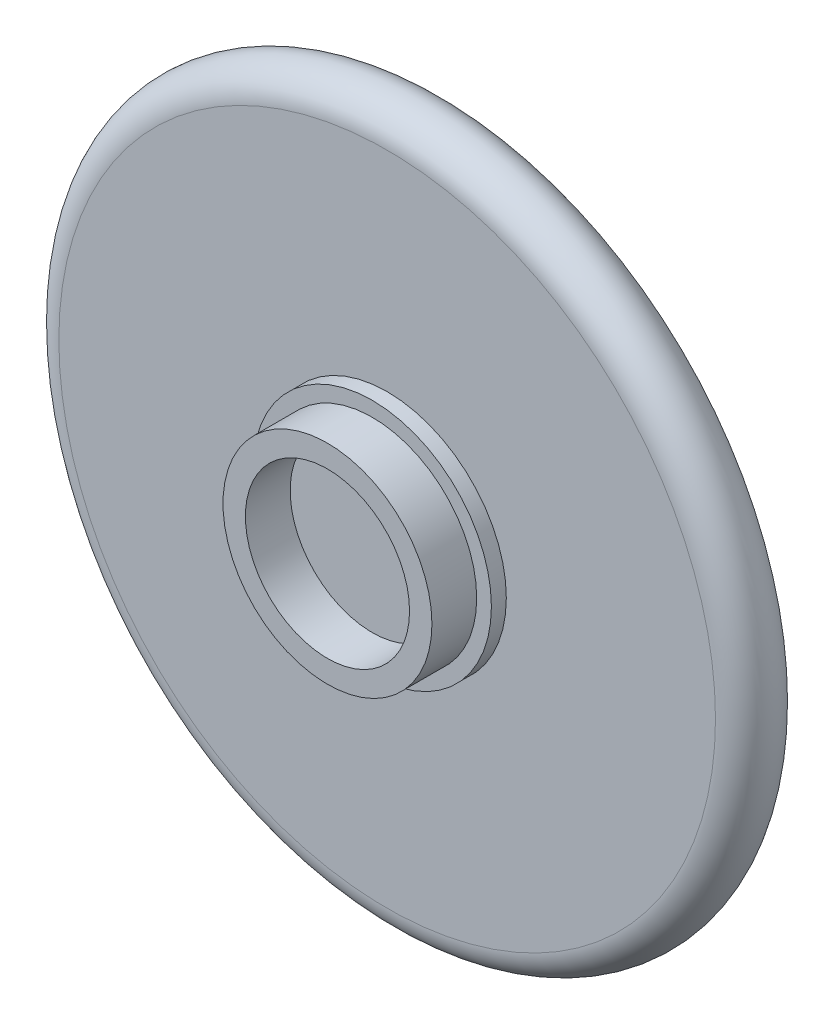
ISO-10303-21;
HEADER;
FILE_DESCRIPTION(('STEP AP214'),'2;1');
FILE_NAME('part.step','',(''),(''),'','','');
FILE_SCHEMA(('AUTOMOTIVE_DESIGN { 1 0 10303 214 1 1 1 1 }'));
ENDSEC;
DATA;
#1=APPLICATION_CONTEXT('core data for automotive mechanical design processes');
#2=APPLICATION_PROTOCOL_DEFINITION('international standard','automotive_design',2000,#1);
#3=PRODUCT_CONTEXT('',#1,'mechanical');
#4=PRODUCT('Part','Part','',(#3));
#5=PRODUCT_RELATED_PRODUCT_CATEGORY('part','',(#4));
#6=PRODUCT_DEFINITION_FORMATION('','',#4);
#7=PRODUCT_DEFINITION_CONTEXT('part definition',#1,'design');
#8=PRODUCT_DEFINITION('design','',#6,#7);
#9=PRODUCT_DEFINITION_SHAPE('','',#8);
#10=(LENGTH_UNIT() NAMED_UNIT(*) SI_UNIT(.MILLI.,.METRE.));
#11=(NAMED_UNIT(*) PLANE_ANGLE_UNIT() SI_UNIT($,.RADIAN.));
#12=(NAMED_UNIT(*) SI_UNIT($,.STERADIAN.) SOLID_ANGLE_UNIT());
#13=UNCERTAINTY_MEASURE_WITH_UNIT(LENGTH_MEASURE(1.E-05),#10,'distance_accuracy_value','');
#14=(GEOMETRIC_REPRESENTATION_CONTEXT(3) GLOBAL_UNCERTAINTY_ASSIGNED_CONTEXT((#13)) GLOBAL_UNIT_ASSIGNED_CONTEXT((#10,
#11,#12)) REPRESENTATION_CONTEXT('',''));
#15=CARTESIAN_POINT('',(0.,0.,0.));
#16=DIRECTION('',(0.,0.,1.));
#17=DIRECTION('',(1.,0.,0.));
#18=AXIS2_PLACEMENT_3D('',#15,#16,#17);
#19=CARTESIAN_POINT('',(0.,0.,0.));
#20=DIRECTION('',(0.,0.,1.));
#21=DIRECTION('',(1.,0.,0.));
#22=AXIS2_PLACEMENT_3D('',#19,#20,#21);
#23=PLANE('',#22);
#24=CARTESIAN_POINT('',(0.,0.,0.));
#25=DIRECTION('',(0.,0.,1.));
#26=DIRECTION('',(1.,0.,0.));
#27=AXIS2_PLACEMENT_3D('',#24,#25,#26);
#28=CIRCLE('',#27,11.);
#29=CARTESIAN_POINT('',(11.,0.,0.));
#30=VERTEX_POINT('',#29);
#31=EDGE_CURVE('E356',#30,#30,#28,.F.);
#32=ORIENTED_EDGE('',*,*,#31,.T.);
#33=EDGE_LOOP('',(#32));
#34=FACE_BOUND('',#33,.T.);
#35=CARTESIAN_POINT('',(0.,5.,0.));
#36=DIRECTION('',(0.,0.,-1.));
#37=DIRECTION('',(-1.,0.,0.));
#38=AXIS2_PLACEMENT_3D('',#35,#36,#37);
#39=CIRCLE('',#38,1.5);
#40=CARTESIAN_POINT('',(0.554469126158169,6.39375894190402,0.));
#41=VERTEX_POINT('',#40);
#42=CARTESIAN_POINT('',(1.49486588027154,4.876,0.));
#43=VERTEX_POINT('',#42);
#44=EDGE_CURVE('E132',#41,#43,#39,.T.);
#45=ORIENTED_EDGE('',*,*,#44,.F.);
#46=CARTESIAN_POINT('',(0.554469126158169,6.39375894190402,0.));
#47=CARTESIAN_POINT('',(1.4375906622717,6.09502868969577,0.));
#48=CARTESIAN_POINT('',(-0.00260021349907383,8.07984889549108,0.));
#49=CARTESIAN_POINT('',(0.00185258226996743,7.1934889015822,0.));
#50=CARTESIAN_POINT('',(0.442267062386248,6.86819716255026,0.));
#51=CARTESIAN_POINT('',(-0.135327531330151,6.49388301391511,0.));
#52=B_SPLINE_CURVE_WITH_KNOTS('',3,(#46,#47,#48,#49,#50,#51),.UNSPECIFIED.,.F.,.F.,(4,1,1,4),
(0.,0.556265111116708,0.561970102831868,1.),.UNSPECIFIED.);
#53=CARTESIAN_POINT('',(-0.135327531330151,6.49388301391511,0.));
#54=VERTEX_POINT('',#53);
#55=EDGE_CURVE('E449',#41,#54,#52,.T.);
#56=ORIENTED_EDGE('',*,*,#55,.T.);
#57=CARTESIAN_POINT('',(-1.49486588027154,4.876,0.));
#58=VERTEX_POINT('',#57);
#59=EDGE_CURVE('E256',#58,#54,#39,.T.);
#60=ORIENTED_EDGE('',*,*,#59,.F.);
#61=CARTESIAN_POINT('',(0.,0.,0.));
#62=DIRECTION('',(0.,0.,-1.));
#63=DIRECTION('',(-1.,0.,0.));
#64=AXIS2_PLACEMENT_3D('',#61,#62,#63);
#65=CIRCLE('',#64,5.1);
#66=CARTESIAN_POINT('',(-5.07443457698444,-0.510013454631162,0.));
#67=VERTEX_POINT('',#66);
#68=EDGE_CURVE('E417',#67,#58,#65,.T.);
#69=ORIENTED_EDGE('',*,*,#68,.F.);
#70=CARTESIAN_POINT('',(-4.60314768120767,-1.95218631923094,0.));
#71=DIRECTION('',(0.,0.,-1.));
#72=DIRECTION('',(-1.,0.,0.));
#73=AXIS2_PLACEMENT_3D('',#70,#71,#72);
#74=CIRCLE('',#73,1.5172257279386);
#75=CARTESIAN_POINT('',(-6.0903801919532,-2.25237520726706,0.));
#76=VERTEX_POINT('',#75);
#77=EDGE_CURVE('E420',#67,#76,#74,.F.);
#78=ORIENTED_EDGE('',*,*,#77,.T.);
#79=CARTESIAN_POINT('',(-6.0903801919532,-2.25237520726706,0.));
#80=CARTESIAN_POINT('',(-6.68498061089297,-1.62456301954497,0.));
#81=CARTESIAN_POINT('',(-7.28964946329909,-4.58455155737586,0.));
#82=CARTESIAN_POINT('',(-6.07150766181626,-2.36060060418071,0.));
#83=CARTESIAN_POINT('',(-5.7842065848789,-2.90459052731579,0.));
#84=B_SPLINE_CURVE_WITH_KNOTS('',3,(#79,#80,#81,#82,#83),.UNSPECIFIED.,.F.,.F.,(4,1,4),(0.,
0.568767055521497,1.),.UNSPECIFIED.);
#85=CARTESIAN_POINT('',(-5.7842065848789,-2.90459052731579,0.));
#86=VERTEX_POINT('',#85);
#87=EDGE_CURVE('E421',#76,#86,#84,.T.);
#88=ORIENTED_EDGE('',*,*,#87,.T.);
#89=CARTESIAN_POINT('',(-3.89397491719962,-3.29347223219208,0.));
#90=VERTEX_POINT('',#89);
#91=EDGE_CURVE('E425',#86,#90,#74,.F.);
#92=ORIENTED_EDGE('',*,*,#91,.T.);
#93=CARTESIAN_POINT('',(0.,0.,0.));
#94=DIRECTION('',(0.,0.,-1.));
#95=DIRECTION('',(-1.,0.,0.));
#96=AXIS2_PLACEMENT_3D('',#93,#94,#95);
#97=CIRCLE('',#96,5.1);
#98=CARTESIAN_POINT('',(3.87347032855387,-3.31756350561867,0.));
#99=VERTEX_POINT('',#98);
#100=EDGE_CURVE('E430',#99,#90,#97,.T.);
#101=ORIENTED_EDGE('',*,*,#100,.F.);
#102=CARTESIAN_POINT('',(4.58407416613072,-1.99656305670843,0.));
#103=DIRECTION('',(0.,0.,-1.));
#104=DIRECTION('',(-1.,0.,0.));
#105=AXIS2_PLACEMENT_3D('',#102,#103,#104);
#106=CIRCLE('',#105,1.5);
#107=CARTESIAN_POINT('',(5.64473433791055,-3.05722322848825,0.));
#108=VERTEX_POINT('',#107);
#109=EDGE_CURVE('E433',#108,#99,#106,.T.);
#110=ORIENTED_EDGE('',*,*,#109,.F.);
#111=CARTESIAN_POINT('',(6.0620999249139,-2.25237520726706,0.));
#112=CARTESIAN_POINT('',(6.02651758885741,-2.75104707180427,0.));
#113=CARTESIAN_POINT('',(8.75990787059198,-2.68786349761413,0.));
#114=CARTESIAN_POINT('',(5.68159124493782,-3.68700255107593,0.));
#115=CARTESIAN_POINT('',(5.64473433791055,-3.05722322848825,0.));
#116=B_SPLINE_CURVE_WITH_KNOTS('',3,(#111,#112,#113,#114,#115),.UNSPECIFIED.,.F.,.F.,(4,1,4),
(0.,0.444279510115038,1.),.UNSPECIFIED.);
#117=CARTESIAN_POINT('',(6.0620999249139,-2.25237520726706,0.));
#118=VERTEX_POINT('',#117);
#119=EDGE_CURVE('E434',#118,#108,#116,.T.);
#120=ORIENTED_EDGE('',*,*,#119,.F.);
#121=CARTESIAN_POINT('',(5.0673079250675,-0.576533080185456,0.));
#122=VERTEX_POINT('',#121);
#123=EDGE_CURVE('E439',#122,#118,#106,.T.);
#124=ORIENTED_EDGE('',*,*,#123,.F.);
#125=CARTESIAN_POINT('',(0.,0.,0.));
#126=DIRECTION('',(0.,0.,-1.));
#127=DIRECTION('',(-1.,0.,0.));
#128=AXIS2_PLACEMENT_3D('',#125,#126,#127);
#129=CIRCLE('',#128,5.1);
#130=EDGE_CURVE('E445',#43,#122,#129,.T.);
#131=ORIENTED_EDGE('',*,*,#130,.F.);
#132=EDGE_LOOP('',(#45,#56,#60,#69,#78,#88,#92,#101,#110,#120,#124,#131));
#133=FACE_BOUND('',#132,.T.);
#134=ADVANCED_FACE('F108',(#34,#133),#23,.F.);
#135=CARTESIAN_POINT('',(0.,0.,1.));
#136=DIRECTION('',(0.,0.,1.));
#137=DIRECTION('',(1.,0.,0.));
#138=AXIS2_PLACEMENT_3D('',#135,#136,#137);
#139=TOROIDAL_SURFACE('',#138,11.,1.);
#140=CARTESIAN_POINT('',(0.,0.,2.));
#141=DIRECTION('',(0.,0.,1.));
#142=DIRECTION('',(1.,0.,0.));
#143=AXIS2_PLACEMENT_3D('',#140,#141,#142);
#144=CIRCLE('',#143,11.);
#145=CARTESIAN_POINT('',(11.,0.,2.));
#146=VERTEX_POINT('',#145);
#147=EDGE_CURVE('E358',#146,#146,#144,.T.);
#148=ORIENTED_EDGE('',*,*,#147,.F.);
#149=EDGE_LOOP('',(#148));
#150=FACE_BOUND('',#149,.T.);
#151=ORIENTED_EDGE('',*,*,#31,.F.);
#152=EDGE_LOOP('',(#151));
#153=FACE_BOUND('',#152,.T.);
#154=ADVANCED_FACE('F111',(#150,#153),#139,.T.);
#155=CARTESIAN_POINT('',(0.,0.,2.));
#156=DIRECTION('',(0.,0.,1.));
#157=DIRECTION('',(1.,0.,0.));
#158=AXIS2_PLACEMENT_3D('',#155,#156,#157);
#159=PLANE('',#158);
#160=CARTESIAN_POINT('',(0.,0.,2.));
#161=DIRECTION('',(0.,0.,1.));
#162=DIRECTION('',(1.,0.,0.));
#163=AXIS2_PLACEMENT_3D('',#160,#161,#162);
#164=CIRCLE('',#163,3.99221085808089);
#165=CARTESIAN_POINT('',(3.99221085808089,0.,2.));
#166=VERTEX_POINT('',#165);
#167=EDGE_CURVE('E879',#166,#166,#164,.T.);
#168=ORIENTED_EDGE('',*,*,#167,.F.);
#169=EDGE_LOOP('',(#168));
#170=FACE_BOUND('',#169,.T.);
#171=ORIENTED_EDGE('',*,*,#147,.T.);
#172=EDGE_LOOP('',(#171));
#173=FACE_BOUND('',#172,.T.);
#174=ADVANCED_FACE('F288',(#170,#173),#159,.T.);
#175=CARTESIAN_POINT('',(0.554469126158169,6.39375894190402,-1.));
#176=CARTESIAN_POINT('',(1.4375906622717,6.09502868969577,-1.));
#177=CARTESIAN_POINT('',(-0.00260021349907383,8.07984889549108,-1.));
#178=CARTESIAN_POINT('',(0.00185258226996743,7.1934889015822,-1.));
#179=CARTESIAN_POINT('',(0.442267062386248,6.86819716255026,-1.));
#180=CARTESIAN_POINT('',(-0.135327531330151,6.49388301391511,-1.));
#181=B_SPLINE_CURVE_WITH_KNOTS('',3,(#175,#176,#177,#178,#179,#180),.UNSPECIFIED.,.F.,.F.,(4,1,
1,4),(0.,0.556265111116708,0.561970102831868,1.),.UNSPECIFIED.);
#182=DIRECTION('',(0.,0.,1.));
#183=VECTOR('',#182,1.);
#184=SURFACE_OF_LINEAR_EXTRUSION('',#181,#183);
#185=ORIENTED_EDGE('',*,*,#55,.F.);
#186=DIRECTION('',(0.,0.,1.));
#187=VECTOR('',#186,1.);
#188=CARTESIAN_POINT('',(0.554469126158169,6.39375894190402,-1.));
#189=LINE('',#188,#187);
#190=CARTESIAN_POINT('',(0.554469126158169,6.39375894190402,-1.));
#191=VERTEX_POINT('',#190);
#192=EDGE_CURVE('E372',#191,#41,#189,.T.);
#193=ORIENTED_EDGE('',*,*,#192,.F.);
#194=CARTESIAN_POINT('',(-0.135327531330151,6.49388301391511,-1.));
#195=VERTEX_POINT('',#194);
#196=EDGE_CURVE('E271',#191,#195,#181,.T.);
#197=ORIENTED_EDGE('',*,*,#196,.T.);
#198=DIRECTION('',(0.,0.,1.));
#199=VECTOR('',#198,1.);
#200=CARTESIAN_POINT('',(-0.135327531330151,6.49388301391511,-1.));
#201=LINE('',#200,#199);
#202=EDGE_CURVE('E246',#195,#54,#201,.T.);
#203=ORIENTED_EDGE('',*,*,#202,.T.);
#204=EDGE_LOOP('',(#185,#193,#197,#203));
#205=FACE_BOUND('',#204,.T.);
#206=ADVANCED_FACE('F283',(#205),#184,.T.);
#207=CARTESIAN_POINT('',(0.,5.,-1.));
#208=DIRECTION('',(0.,0.,1.));
#209=DIRECTION('',(1.,0.,0.));
#210=AXIS2_PLACEMENT_3D('',#207,#208,#209);
#211=CYLINDRICAL_SURFACE('',#210,1.5);
#212=ORIENTED_EDGE('',*,*,#44,.T.);
#213=DIRECTION('',(0.,0.,1.));
#214=VECTOR('',#213,1.);
#215=CARTESIAN_POINT('',(1.49486588027154,4.876,-1.));
#216=LINE('',#215,#214);
#217=CARTESIAN_POINT('',(1.49486588027154,4.876,-1.));
#218=VERTEX_POINT('',#217);
#219=EDGE_CURVE('E385',#218,#43,#216,.T.);
#220=ORIENTED_EDGE('',*,*,#219,.F.);
#221=CARTESIAN_POINT('',(0.,5.,-1.));
#222=DIRECTION('',(0.,0.,-1.));
#223=DIRECTION('',(-1.,0.,0.));
#224=AXIS2_PLACEMENT_3D('',#221,#222,#223);
#225=CIRCLE('',#224,1.5);
#226=EDGE_CURVE('E277',#191,#218,#225,.T.);
#227=ORIENTED_EDGE('',*,*,#226,.F.);
#228=ORIENTED_EDGE('',*,*,#192,.T.);
#229=EDGE_LOOP('',(#212,#220,#227,#228));
#230=FACE_BOUND('',#229,.T.);
#231=ADVANCED_FACE('F287',(#230),#211,.T.);
#232=CARTESIAN_POINT('',(0.,0.,-1.));
#233=DIRECTION('',(0.,0.,1.));
#234=DIRECTION('',(1.,0.,0.));
#235=AXIS2_PLACEMENT_3D('',#232,#233,#234);
#236=CYLINDRICAL_SURFACE('',#235,5.1);
#237=ORIENTED_EDGE('',*,*,#130,.T.);
#238=DIRECTION('',(0.,0.,1.));
#239=VECTOR('',#238,1.);
#240=CARTESIAN_POINT('',(5.0673079250675,-0.576533080185456,-1.));
#241=LINE('',#240,#239);
#242=CARTESIAN_POINT('',(5.0673079250675,-0.576533080185456,-1.));
#243=VERTEX_POINT('',#242);
#244=EDGE_CURVE('E388',#243,#122,#241,.T.);
#245=ORIENTED_EDGE('',*,*,#244,.F.);
#246=CARTESIAN_POINT('',(0.,0.,-1.));
#247=DIRECTION('',(0.,0.,-1.));
#248=DIRECTION('',(-1.,0.,0.));
#249=AXIS2_PLACEMENT_3D('',#246,#247,#248);
#250=CIRCLE('',#249,5.1);
#251=EDGE_CURVE('E524',#218,#243,#250,.T.);
#252=ORIENTED_EDGE('',*,*,#251,.F.);
#253=ORIENTED_EDGE('',*,*,#219,.T.);
#254=EDGE_LOOP('',(#237,#245,#252,#253));
#255=FACE_BOUND('',#254,.T.);
#256=ADVANCED_FACE('F290',(#255),#236,.T.);
#257=CARTESIAN_POINT('',(4.58407416613072,-1.99656305670843,-1.));
#258=DIRECTION('',(0.,0.,1.));
#259=DIRECTION('',(1.,0.,0.));
#260=AXIS2_PLACEMENT_3D('',#257,#258,#259);
#261=CYLINDRICAL_SURFACE('',#260,1.5);
#262=ORIENTED_EDGE('',*,*,#123,.T.);
#263=DIRECTION('',(0.,0.,1.));
#264=VECTOR('',#263,1.);
#265=CARTESIAN_POINT('',(6.0620999249139,-2.25237520726706,-1.));
#266=LINE('',#265,#264);
#267=CARTESIAN_POINT('',(6.0620999249139,-2.25237520726706,-1.));
#268=VERTEX_POINT('',#267);
#269=EDGE_CURVE('E391',#268,#118,#266,.T.);
#270=ORIENTED_EDGE('',*,*,#269,.F.);
#271=CARTESIAN_POINT('',(4.58407416613072,-1.99656305670843,-1.));
#272=DIRECTION('',(0.,0.,-1.));
#273=DIRECTION('',(-1.,0.,0.));
#274=AXIS2_PLACEMENT_3D('',#271,#272,#273);
#275=CIRCLE('',#274,1.5);
#276=EDGE_CURVE('E513',#243,#268,#275,.T.);
#277=ORIENTED_EDGE('',*,*,#276,.F.);
#278=ORIENTED_EDGE('',*,*,#244,.T.);
#279=EDGE_LOOP('',(#262,#270,#277,#278));
#280=FACE_BOUND('',#279,.T.);
#281=ADVANCED_FACE('F502',(#280),#261,.T.);
#282=CARTESIAN_POINT('',(6.0620999249139,-2.25237520726706,-1.));
#283=CARTESIAN_POINT('',(6.02651758885741,-2.75104707180427,-1.));
#284=CARTESIAN_POINT('',(8.75990787059198,-2.68786349761413,-1.));
#285=CARTESIAN_POINT('',(5.68159124493782,-3.68700255107593,-1.));
#286=CARTESIAN_POINT('',(5.64473433791055,-3.05722322848825,-1.));
#287=B_SPLINE_CURVE_WITH_KNOTS('',3,(#282,#283,#284,#285,#286),.UNSPECIFIED.,.F.,.F.,(4,1,4),
(0.,0.444279510115038,1.),.UNSPECIFIED.);
#288=DIRECTION('',(0.,0.,1.));
#289=VECTOR('',#288,1.);
#290=SURFACE_OF_LINEAR_EXTRUSION('',#287,#289);
#291=ORIENTED_EDGE('',*,*,#119,.T.);
#292=DIRECTION('',(0.,0.,1.));
#293=VECTOR('',#292,1.);
#294=CARTESIAN_POINT('',(5.64473433791055,-3.05722322848825,-1.));
#295=LINE('',#294,#293);
#296=CARTESIAN_POINT('',(5.64473433791055,-3.05722322848825,-1.));
#297=VERTEX_POINT('',#296);
#298=EDGE_CURVE('E394',#297,#108,#295,.T.);
#299=ORIENTED_EDGE('',*,*,#298,.F.);
#300=EDGE_CURVE('E506',#268,#297,#287,.T.);
#301=ORIENTED_EDGE('',*,*,#300,.F.);
#302=ORIENTED_EDGE('',*,*,#269,.T.);
#303=EDGE_LOOP('',(#291,#299,#301,#302));
#304=FACE_BOUND('',#303,.T.);
#305=ADVANCED_FACE('F500',(#304),#290,.F.);
#306=ORIENTED_EDGE('',*,*,#109,.T.);
#307=DIRECTION('',(0.,0.,1.));
#308=VECTOR('',#307,1.);
#309=CARTESIAN_POINT('',(3.87347032855387,-3.31756350561867,-1.));
#310=LINE('',#309,#308);
#311=CARTESIAN_POINT('',(3.87347032855387,-3.31756350561867,-1.));
#312=VERTEX_POINT('',#311);
#313=EDGE_CURVE('E397',#312,#99,#310,.T.);
#314=ORIENTED_EDGE('',*,*,#313,.F.);
#315=EDGE_CURVE('E512',#297,#312,#275,.T.);
#316=ORIENTED_EDGE('',*,*,#315,.F.);
#317=ORIENTED_EDGE('',*,*,#298,.T.);
#318=EDGE_LOOP('',(#306,#314,#316,#317));
#319=FACE_BOUND('',#318,.T.);
#320=ADVANCED_FACE('F497',(#319),#261,.T.);
#321=CARTESIAN_POINT('',(0.,0.,-1.));
#322=DIRECTION('',(0.,0.,1.));
#323=DIRECTION('',(1.,0.,0.));
#324=AXIS2_PLACEMENT_3D('',#321,#322,#323);
#325=CYLINDRICAL_SURFACE('',#324,5.1);
#326=ORIENTED_EDGE('',*,*,#100,.T.);
#327=DIRECTION('',(0.,0.,1.));
#328=VECTOR('',#327,1.);
#329=CARTESIAN_POINT('',(-3.89397491719962,-3.29347223219208,-1.));
#330=LINE('',#329,#328);
#331=CARTESIAN_POINT('',(-3.89397491719962,-3.29347223219208,-1.));
#332=VERTEX_POINT('',#331);
#333=EDGE_CURVE('E400',#332,#90,#330,.T.);
#334=ORIENTED_EDGE('',*,*,#333,.F.);
#335=CARTESIAN_POINT('',(0.,0.,-1.));
#336=DIRECTION('',(0.,0.,-1.));
#337=DIRECTION('',(-1.,0.,0.));
#338=AXIS2_PLACEMENT_3D('',#335,#336,#337);
#339=CIRCLE('',#338,5.1);
#340=EDGE_CURVE('E514',#312,#332,#339,.T.);
#341=ORIENTED_EDGE('',*,*,#340,.F.);
#342=ORIENTED_EDGE('',*,*,#313,.T.);
#343=EDGE_LOOP('',(#326,#334,#341,#342));
#344=FACE_BOUND('',#343,.T.);
#345=ADVANCED_FACE('F494',(#344),#325,.T.);
#346=CARTESIAN_POINT('',(-4.60314768120767,-1.95218631923094,-1.));
#347=DIRECTION('',(0.,0.,1.));
#348=DIRECTION('',(1.,0.,0.));
#349=AXIS2_PLACEMENT_3D('',#346,#347,#348);
#350=CYLINDRICAL_SURFACE('',#349,1.5172257279386);
#351=ORIENTED_EDGE('',*,*,#91,.F.);
#352=DIRECTION('',(0.,0.,1.));
#353=VECTOR('',#352,1.);
#354=CARTESIAN_POINT('',(-5.7842065848789,-2.90459052731579,-1.));
#355=LINE('',#354,#353);
#356=CARTESIAN_POINT('',(-5.7842065848789,-2.90459052731579,-1.));
#357=VERTEX_POINT('',#356);
#358=EDGE_CURVE('E403',#357,#86,#355,.T.);
#359=ORIENTED_EDGE('',*,*,#358,.F.);
#360=CARTESIAN_POINT('',(-4.60314768120767,-1.95218631923094,-1.));
#361=DIRECTION('',(0.,0.,-1.));
#362=DIRECTION('',(-1.,0.,0.));
#363=AXIS2_PLACEMENT_3D('',#360,#361,#362);
#364=CIRCLE('',#363,1.5172257279386);
#365=EDGE_CURVE('E480',#357,#332,#364,.F.);
#366=ORIENTED_EDGE('',*,*,#365,.T.);
#367=ORIENTED_EDGE('',*,*,#333,.T.);
#368=EDGE_LOOP('',(#351,#359,#366,#367));
#369=FACE_BOUND('',#368,.T.);
#370=ADVANCED_FACE('F491',(#369),#350,.T.);
#371=CARTESIAN_POINT('',(-6.0903801919532,-2.25237520726706,-1.));
#372=CARTESIAN_POINT('',(-6.68498061089297,-1.62456301954497,-1.));
#373=CARTESIAN_POINT('',(-7.28964946329909,-4.58455155737586,-1.));
#374=CARTESIAN_POINT('',(-6.07150766181626,-2.36060060418071,-1.));
#375=CARTESIAN_POINT('',(-5.7842065848789,-2.90459052731579,-1.));
#376=B_SPLINE_CURVE_WITH_KNOTS('',3,(#371,#372,#373,#374,#375),.UNSPECIFIED.,.F.,.F.,(4,1,4),
(0.,0.568767055521497,1.),.UNSPECIFIED.);
#377=DIRECTION('',(0.,0.,1.));
#378=VECTOR('',#377,1.);
#379=SURFACE_OF_LINEAR_EXTRUSION('',#376,#378);
#380=ORIENTED_EDGE('',*,*,#87,.F.);
#381=DIRECTION('',(0.,0.,1.));
#382=VECTOR('',#381,1.);
#383=CARTESIAN_POINT('',(-6.0903801919532,-2.25237520726706,-1.));
#384=LINE('',#383,#382);
#385=CARTESIAN_POINT('',(-6.0903801919532,-2.25237520726706,-1.));
#386=VERTEX_POINT('',#385);
#387=EDGE_CURVE('E406',#386,#76,#384,.T.);
#388=ORIENTED_EDGE('',*,*,#387,.F.);
#389=EDGE_CURVE('E474',#386,#357,#376,.T.);
#390=ORIENTED_EDGE('',*,*,#389,.T.);
#391=ORIENTED_EDGE('',*,*,#358,.T.);
#392=EDGE_LOOP('',(#380,#388,#390,#391));
#393=FACE_BOUND('',#392,.T.);
#394=ADVANCED_FACE('F486',(#393),#379,.T.);
#395=ORIENTED_EDGE('',*,*,#77,.F.);
#396=DIRECTION('',(0.,0.,1.));
#397=VECTOR('',#396,1.);
#398=CARTESIAN_POINT('',(-5.07443457698444,-0.510013454631162,-1.));
#399=LINE('',#398,#397);
#400=CARTESIAN_POINT('',(-5.07443457698444,-0.510013454631162,-1.));
#401=VERTEX_POINT('',#400);
#402=EDGE_CURVE('E409',#401,#67,#399,.T.);
#403=ORIENTED_EDGE('',*,*,#402,.F.);
#404=EDGE_CURVE('E473',#401,#386,#364,.F.);
#405=ORIENTED_EDGE('',*,*,#404,.T.);
#406=ORIENTED_EDGE('',*,*,#387,.T.);
#407=EDGE_LOOP('',(#395,#403,#405,#406));
#408=FACE_BOUND('',#407,.T.);
#409=ADVANCED_FACE('F490',(#408),#350,.T.);
#410=CARTESIAN_POINT('',(0.,0.,-1.));
#411=DIRECTION('',(0.,0.,1.));
#412=DIRECTION('',(1.,0.,0.));
#413=AXIS2_PLACEMENT_3D('',#410,#411,#412);
#414=CYLINDRICAL_SURFACE('',#413,5.1);
#415=ORIENTED_EDGE('',*,*,#68,.T.);
#416=DIRECTION('',(0.,0.,1.));
#417=VECTOR('',#416,1.);
#418=CARTESIAN_POINT('',(-1.49486588027154,4.876,-1.));
#419=LINE('',#418,#417);
#420=CARTESIAN_POINT('',(-1.49486588027154,4.876,-1.));
#421=VERTEX_POINT('',#420);
#422=EDGE_CURVE('E412',#421,#58,#419,.T.);
#423=ORIENTED_EDGE('',*,*,#422,.F.);
#424=CARTESIAN_POINT('',(0.,0.,-1.));
#425=DIRECTION('',(0.,0.,-1.));
#426=DIRECTION('',(-1.,0.,0.));
#427=AXIS2_PLACEMENT_3D('',#424,#425,#426);
#428=CIRCLE('',#427,5.1);
#429=EDGE_CURVE('E470',#401,#421,#428,.T.);
#430=ORIENTED_EDGE('',*,*,#429,.F.);
#431=ORIENTED_EDGE('',*,*,#402,.T.);
#432=EDGE_LOOP('',(#415,#423,#430,#431));
#433=FACE_BOUND('',#432,.T.);
#434=ADVANCED_FACE('F312',(#433),#414,.T.);
#435=CARTESIAN_POINT('',(-4.60314768120767,-1.95218631923094,-1.));
#436=DIRECTION('',(0.,0.,1.));
#437=DIRECTION('',(1.,0.,0.));
#438=AXIS2_PLACEMENT_3D('',#435,#436,#437);
#439=CYLINDRICAL_SURFACE('',#438,1.5172257279386);
#440=CARTESIAN_POINT('',(-4.60314768120767,-1.95218631923094,0.));
#441=DIRECTION('',(0.,0.,-1.));
#442=DIRECTION('',(-1.,0.,0.));
#443=AXIS2_PLACEMENT_3D('',#440,#441,#442);
#444=CIRCLE('',#443,1.5172257279386);
#445=CARTESIAN_POINT('',(-3.72180935530929,-3.18718294466011,0.));
#446=VERTEX_POINT('',#445);
#447=CARTESIAN_POINT('',(-4.87834832437816,-0.460127836624652,0.));
#448=VERTEX_POINT('',#447);
#449=EDGE_CURVE('E241',#446,#448,#444,.F.);
#450=ORIENTED_EDGE('',*,*,#449,.F.);
#451=DIRECTION('',(0.,0.,1.));
#452=VECTOR('',#451,1.);
#453=CARTESIAN_POINT('',(-3.72180935530929,-3.18718294466011,-1.));
#454=LINE('',#453,#452);
#455=CARTESIAN_POINT('',(-3.72180935530929,-3.18718294466011,-1.));
#456=VERTEX_POINT('',#455);
#457=EDGE_CURVE('E235',#456,#446,#454,.T.);
#458=ORIENTED_EDGE('',*,*,#457,.F.);
#459=CARTESIAN_POINT('',(-4.60314768120767,-1.95218631923094,-1.));
#460=DIRECTION('',(0.,0.,-1.));
#461=DIRECTION('',(-1.,0.,0.));
#462=AXIS2_PLACEMENT_3D('',#459,#460,#461);
#463=CIRCLE('',#462,1.5172257279386);
#464=CARTESIAN_POINT('',(-4.87834832437816,-0.460127836624652,-1.));
#465=VERTEX_POINT('',#464);
#466=EDGE_CURVE('E238',#456,#465,#463,.F.);
#467=ORIENTED_EDGE('',*,*,#466,.T.);
#468=DIRECTION('',(0.,0.,1.));
#469=VECTOR('',#468,1.);
#470=CARTESIAN_POINT('',(-4.87834832437816,-0.460127836624652,-1.));
#471=LINE('',#470,#469);
#472=EDGE_CURVE('E381',#465,#448,#471,.T.);
#473=ORIENTED_EDGE('',*,*,#472,.T.);
#474=EDGE_LOOP('',(#450,#458,#467,#473));
#475=FACE_BOUND('',#474,.T.);
#476=ADVANCED_FACE('F237',(#475),#439,.T.);
#477=CARTESIAN_POINT('',(0.,0.,-1.));
#478=DIRECTION('',(0.,0.,1.));
#479=DIRECTION('',(1.,0.,0.));
#480=AXIS2_PLACEMENT_3D('',#477,#478,#479);
#481=CYLINDRICAL_SURFACE('',#480,4.9);
#482=CARTESIAN_POINT('',(0.,0.,0.));
#483=DIRECTION('',(0.,0.,-1.));
#484=DIRECTION('',(-1.,0.,0.));
#485=AXIS2_PLACEMENT_3D('',#482,#483,#484);
#486=CIRCLE('',#485,4.9);
#487=CARTESIAN_POINT('',(3.70219688473962,-3.20994364851227,0.));
#488=VERTEX_POINT('',#487);
#489=EDGE_CURVE('E466',#488,#446,#486,.T.);
#490=ORIENTED_EDGE('',*,*,#489,.F.);
#491=DIRECTION('',(0.,0.,1.));
#492=VECTOR('',#491,1.);
#493=CARTESIAN_POINT('',(3.70219688473962,-3.20994364851227,-1.));
#494=LINE('',#493,#492);
#495=CARTESIAN_POINT('',(3.70219688473962,-3.20994364851227,-1.));
#496=VERTEX_POINT('',#495);
#497=EDGE_CURVE('E247',#496,#488,#494,.T.);
#498=ORIENTED_EDGE('',*,*,#497,.F.);
#499=CARTESIAN_POINT('',(0.,0.,-1.));
#500=DIRECTION('',(0.,0.,-1.));
#501=DIRECTION('',(-1.,0.,0.));
#502=AXIS2_PLACEMENT_3D('',#499,#500,#501);
#503=CIRCLE('',#502,4.9);
#504=EDGE_CURVE('E253',#496,#456,#503,.T.);
#505=ORIENTED_EDGE('',*,*,#504,.T.);
#506=ORIENTED_EDGE('',*,*,#457,.T.);
#507=EDGE_LOOP('',(#490,#498,#505,#506));
#508=FACE_BOUND('',#507,.T.);
#509=ADVANCED_FACE('F258',(#508),#481,.F.);
#510=CARTESIAN_POINT('',(4.58407416613072,-1.99656305670843,-1.));
#511=DIRECTION('',(0.,0.,1.));
#512=DIRECTION('',(1.,0.,0.));
#513=AXIS2_PLACEMENT_3D('',#510,#511,#512);
#514=CYLINDRICAL_SURFACE('',#513,1.5);
#515=CARTESIAN_POINT('',(4.58407416613072,-1.99656305670843,0.));
#516=DIRECTION('',(0.,0.,-1.));
#517=DIRECTION('',(-1.,0.,0.));
#518=AXIS2_PLACEMENT_3D('',#515,#516,#517);
#519=CIRCLE('',#518,1.5);
#520=CARTESIAN_POINT('',(4.87185543559129,-0.524427892755178,0.));
#521=VERTEX_POINT('',#520);
#522=EDGE_CURVE('E463',#488,#521,#519,.T.);
#523=ORIENTED_EDGE('',*,*,#522,.T.);
#524=DIRECTION('',(0.,0.,1.));
#525=VECTOR('',#524,1.);
#526=CARTESIAN_POINT('',(4.87185543559129,-0.524427892755178,-1.));
#527=LINE('',#526,#525);
#528=CARTESIAN_POINT('',(4.87185543559129,-0.524427892755178,-1.));
#529=VERTEX_POINT('',#528);
#530=EDGE_CURVE('E375',#529,#521,#527,.T.);
#531=ORIENTED_EDGE('',*,*,#530,.F.);
#532=CARTESIAN_POINT('',(4.58407416613072,-1.99656305670843,-1.));
#533=DIRECTION('',(0.,0.,-1.));
#534=DIRECTION('',(-1.,0.,0.));
#535=AXIS2_PLACEMENT_3D('',#532,#533,#534);
#536=CIRCLE('',#535,1.5);
#537=EDGE_CURVE('E260',#496,#529,#536,.T.);
#538=ORIENTED_EDGE('',*,*,#537,.F.);
#539=ORIENTED_EDGE('',*,*,#497,.T.);
#540=EDGE_LOOP('',(#523,#531,#538,#539));
#541=FACE_BOUND('',#540,.T.);
#542=ADVANCED_FACE('F303',(#541),#514,.T.);
#543=CARTESIAN_POINT('',(0.,0.,-1.));
#544=DIRECTION('',(0.,0.,1.));
#545=DIRECTION('',(1.,0.,0.));
#546=AXIS2_PLACEMENT_3D('',#543,#544,#545);
#547=CYLINDRICAL_SURFACE('',#546,4.9);
#548=CARTESIAN_POINT('',(0.,0.,0.));
#549=DIRECTION('',(0.,0.,-1.));
#550=DIRECTION('',(-1.,0.,0.));
#551=AXIS2_PLACEMENT_3D('',#548,#549,#550);
#552=CIRCLE('',#551,4.9);
#553=CARTESIAN_POINT('',(1.46459004502967,4.676,0.));
#554=VERTEX_POINT('',#553);
#555=EDGE_CURVE('E460',#554,#521,#552,.T.);
#556=ORIENTED_EDGE('',*,*,#555,.F.);
#557=DIRECTION('',(0.,0.,1.));
#558=VECTOR('',#557,1.);
#559=CARTESIAN_POINT('',(1.46459004502967,4.676,-1.));
#560=LINE('',#559,#558);
#561=CARTESIAN_POINT('',(1.46459004502967,4.676,-1.));
#562=VERTEX_POINT('',#561);
#563=EDGE_CURVE('E377',#562,#554,#560,.T.);
#564=ORIENTED_EDGE('',*,*,#563,.F.);
#565=CARTESIAN_POINT('',(0.,0.,-1.));
#566=DIRECTION('',(0.,0.,-1.));
#567=DIRECTION('',(-1.,0.,0.));
#568=AXIS2_PLACEMENT_3D('',#565,#566,#567);
#569=CIRCLE('',#568,4.9);
#570=EDGE_CURVE('E262',#562,#529,#569,.T.);
#571=ORIENTED_EDGE('',*,*,#570,.T.);
#572=ORIENTED_EDGE('',*,*,#530,.T.);
#573=EDGE_LOOP('',(#556,#564,#571,#572));
#574=FACE_BOUND('',#573,.T.);
#575=ADVANCED_FACE('F300',(#574),#547,.F.);
#576=CARTESIAN_POINT('',(0.,5.,-1.));
#577=DIRECTION('',(0.,0.,1.));
#578=DIRECTION('',(1.,0.,0.));
#579=AXIS2_PLACEMENT_3D('',#576,#577,#578);
#580=CYLINDRICAL_SURFACE('',#579,1.5);
#581=CARTESIAN_POINT('',(0.,5.,0.));
#582=DIRECTION('',(0.,0.,-1.));
#583=DIRECTION('',(-1.,0.,0.));
#584=AXIS2_PLACEMENT_3D('',#581,#582,#583);
#585=CIRCLE('',#584,1.5);
#586=CARTESIAN_POINT('',(-1.46459004502967,4.676,0.));
#587=VERTEX_POINT('',#586);
#588=EDGE_CURVE('E124',#554,#587,#585,.T.);
#589=ORIENTED_EDGE('',*,*,#588,.T.);
#590=DIRECTION('',(0.,0.,1.));
#591=VECTOR('',#590,1.);
#592=CARTESIAN_POINT('',(-1.46459004502967,4.676,-1.));
#593=LINE('',#592,#591);
#594=CARTESIAN_POINT('',(-1.46459004502967,4.676,-1.));
#595=VERTEX_POINT('',#594);
#596=EDGE_CURVE('E379',#595,#587,#593,.T.);
#597=ORIENTED_EDGE('',*,*,#596,.F.);
#598=CARTESIAN_POINT('',(0.,5.,-1.));
#599=DIRECTION('',(0.,0.,-1.));
#600=DIRECTION('',(-1.,0.,0.));
#601=AXIS2_PLACEMENT_3D('',#598,#599,#600);
#602=CIRCLE('',#601,1.5);
#603=EDGE_CURVE('E268',#562,#595,#602,.T.);
#604=ORIENTED_EDGE('',*,*,#603,.F.);
#605=ORIENTED_EDGE('',*,*,#563,.T.);
#606=EDGE_LOOP('',(#589,#597,#604,#605));
#607=FACE_BOUND('',#606,.T.);
#608=ADVANCED_FACE('F296',(#607),#580,.T.);
#609=CARTESIAN_POINT('',(0.,0.,-1.));
#610=DIRECTION('',(0.,0.,1.));
#611=DIRECTION('',(1.,0.,0.));
#612=AXIS2_PLACEMENT_3D('',#609,#610,#611);
#613=CYLINDRICAL_SURFACE('',#612,4.9);
#614=CARTESIAN_POINT('',(0.,0.,0.));
#615=DIRECTION('',(0.,0.,-1.));
#616=DIRECTION('',(-1.,0.,0.));
#617=AXIS2_PLACEMENT_3D('',#614,#615,#616);
#618=CIRCLE('',#617,4.9);
#619=EDGE_CURVE('E453',#448,#587,#618,.T.);
#620=ORIENTED_EDGE('',*,*,#619,.F.);
#621=ORIENTED_EDGE('',*,*,#472,.F.);
#622=CARTESIAN_POINT('',(0.,0.,-1.));
#623=DIRECTION('',(0.,0.,-1.));
#624=DIRECTION('',(-1.,0.,0.));
#625=AXIS2_PLACEMENT_3D('',#622,#623,#624);
#626=CIRCLE('',#625,4.9);
#627=EDGE_CURVE('E255',#465,#595,#626,.T.);
#628=ORIENTED_EDGE('',*,*,#627,.T.);
#629=ORIENTED_EDGE('',*,*,#596,.T.);
#630=EDGE_LOOP('',(#620,#621,#628,#629));
#631=FACE_BOUND('',#630,.T.);
#632=ADVANCED_FACE('F292',(#631),#613,.F.);
#633=ORIENTED_EDGE('',*,*,#59,.T.);
#634=ORIENTED_EDGE('',*,*,#202,.F.);
#635=EDGE_CURVE('E383',#421,#195,#225,.T.);
#636=ORIENTED_EDGE('',*,*,#635,.F.);
#637=ORIENTED_EDGE('',*,*,#422,.T.);
#638=EDGE_LOOP('',(#633,#634,#636,#637));
#639=FACE_BOUND('',#638,.T.);
#640=ADVANCED_FACE('F295',(#639),#211,.T.);
#641=CARTESIAN_POINT('',(0.,0.,-1.));
#642=DIRECTION('',(0.,0.,-1.));
#643=DIRECTION('',(-1.,0.,0.));
#644=AXIS2_PLACEMENT_3D('',#641,#642,#643);
#645=PLANE('',#644);
#646=ORIENTED_EDGE('',*,*,#466,.F.);
#647=ORIENTED_EDGE('',*,*,#504,.F.);
#648=ORIENTED_EDGE('',*,*,#537,.T.);
#649=ORIENTED_EDGE('',*,*,#570,.F.);
#650=ORIENTED_EDGE('',*,*,#603,.T.);
#651=ORIENTED_EDGE('',*,*,#627,.F.);
#652=EDGE_LOOP('',(#646,#647,#648,#649,#650,#651));
#653=FACE_BOUND('',#652,.T.);
#654=ORIENTED_EDGE('',*,*,#196,.F.);
#655=ORIENTED_EDGE('',*,*,#226,.T.);
#656=ORIENTED_EDGE('',*,*,#251,.T.);
#657=ORIENTED_EDGE('',*,*,#276,.T.);
#658=ORIENTED_EDGE('',*,*,#300,.T.);
#659=ORIENTED_EDGE('',*,*,#315,.T.);
#660=ORIENTED_EDGE('',*,*,#340,.T.);
#661=ORIENTED_EDGE('',*,*,#365,.F.);
#662=ORIENTED_EDGE('',*,*,#389,.F.);
#663=ORIENTED_EDGE('',*,*,#404,.F.);
#664=ORIENTED_EDGE('',*,*,#429,.T.);
#665=ORIENTED_EDGE('',*,*,#635,.T.);
#666=EDGE_LOOP('',(#654,#655,#656,#657,#658,#659,#660,#661,#662,#663,#664,#665));
#667=FACE_BOUND('',#666,.T.);
#668=ADVANCED_FACE('F251',(#653,#667),#645,.T.);
#669=CARTESIAN_POINT('',(0.,0.,-1.));
#670=DIRECTION('',(0.,0.,-1.));
#671=DIRECTION('',(-1.,0.,0.));
#672=AXIS2_PLACEMENT_3D('',#669,#670,#671);
#673=PLANE('',#672);
#674=CARTESIAN_POINT('',(0.,0.,-1.));
#675=DIRECTION('',(0.,0.,-1.));
#676=DIRECTION('',(-1.,0.,0.));
#677=AXIS2_PLACEMENT_3D('',#674,#675,#676);
#678=CIRCLE('',#677,2.5);
#679=CARTESIAN_POINT('',(-2.5,0.,-1.));
#680=VERTEX_POINT('',#679);
#681=EDGE_CURVE('E370',#680,#680,#678,.T.);
#682=ORIENTED_EDGE('',*,*,#681,.T.);
#683=EDGE_LOOP('',(#682));
#684=FACE_BOUND('',#683,.T.);
#685=ADVANCED_FACE('F313',(#684),#673,.T.);
#686=CARTESIAN_POINT('',(0.,0.,-1.));
#687=DIRECTION('',(0.,0.,1.));
#688=DIRECTION('',(1.,0.,0.));
#689=AXIS2_PLACEMENT_3D('',#686,#687,#688);
#690=CYLINDRICAL_SURFACE('',#689,2.5);
#691=ORIENTED_EDGE('',*,*,#681,.F.);
#692=EDGE_LOOP('',(#691));
#693=FACE_BOUND('',#692,.T.);
#694=CARTESIAN_POINT('',(0.,0.,0.));
#695=DIRECTION('',(0.,0.,1.));
#696=DIRECTION('',(1.,0.,0.));
#697=AXIS2_PLACEMENT_3D('',#694,#695,#696);
#698=CIRCLE('',#697,2.5);
#699=CARTESIAN_POINT('',(2.5,0.,0.));
#700=VERTEX_POINT('',#699);
#701=EDGE_CURVE('E117',#700,#700,#698,.F.);
#702=ORIENTED_EDGE('',*,*,#701,.T.);
#703=EDGE_LOOP('',(#702));
#704=FACE_BOUND('',#703,.T.);
#705=ADVANCED_FACE('F316',(#693,#704),#690,.T.);
#706=ORIENTED_EDGE('',*,*,#701,.F.);
#707=EDGE_LOOP('',(#706));
#708=FACE_BOUND('',#707,.T.);
#709=ORIENTED_EDGE('',*,*,#489,.T.);
#710=ORIENTED_EDGE('',*,*,#449,.T.);
#711=ORIENTED_EDGE('',*,*,#619,.T.);
#712=ORIENTED_EDGE('',*,*,#588,.F.);
#713=ORIENTED_EDGE('',*,*,#555,.T.);
#714=ORIENTED_EDGE('',*,*,#522,.F.);
#715=EDGE_LOOP('',(#709,#710,#711,#712,#713,#714));
#716=FACE_BOUND('',#715,.T.);
#717=ADVANCED_FACE('F320',(#708,#716),#23,.F.);
#718=CARTESIAN_POINT('',(0.,0.,2.5));
#719=DIRECTION('',(0.,0.,-1.));
#720=DIRECTION('',(-1.,0.,0.));
#721=AXIS2_PLACEMENT_3D('',#718,#719,#720);
#722=CYLINDRICAL_SURFACE('',#721,3.99221085808089);
#723=CARTESIAN_POINT('',(0.,0.,2.5));
#724=DIRECTION('',(0.,0.,1.));
#725=DIRECTION('',(1.,0.,0.));
#726=AXIS2_PLACEMENT_3D('',#723,#724,#725);
#727=CIRCLE('',#726,3.99221085808089);
#728=CARTESIAN_POINT('',(3.99221085808089,0.,2.5));
#729=VERTEX_POINT('',#728);
#730=EDGE_CURVE('E878',#729,#729,#727,.T.);
#731=ORIENTED_EDGE('',*,*,#730,.F.);
#732=EDGE_LOOP('',(#731));
#733=FACE_BOUND('',#732,.T.);
#734=ORIENTED_EDGE('',*,*,#167,.T.);
#735=EDGE_LOOP('',(#734));
#736=FACE_BOUND('',#735,.T.);
#737=ADVANCED_FACE('F339',(#733,#736),#722,.T.);
#738=CARTESIAN_POINT('',(0.,0.,2.5));
#739=DIRECTION('',(0.,0.,1.));
#740=DIRECTION('',(1.,0.,0.));
#741=AXIS2_PLACEMENT_3D('',#738,#739,#740);
#742=PLANE('',#741);
#743=CARTESIAN_POINT('',(0.,0.,2.5));
#744=DIRECTION('',(0.,0.,1.));
#745=DIRECTION('',(1.,0.,0.));
#746=AXIS2_PLACEMENT_3D('',#743,#744,#745);
#747=CIRCLE('',#746,3.5);
#748=CARTESIAN_POINT('',(3.5,0.,2.5));
#749=VERTEX_POINT('',#748);
#750=EDGE_CURVE('E469',#749,#749,#747,.T.);
#751=ORIENTED_EDGE('',*,*,#750,.F.);
#752=EDGE_LOOP('',(#751));
#753=FACE_BOUND('',#752,.T.);
#754=ORIENTED_EDGE('',*,*,#730,.T.);
#755=EDGE_LOOP('',(#754));
#756=FACE_BOUND('',#755,.T.);
#757=ADVANCED_FACE('F334',(#753,#756),#742,.T.);
#758=CARTESIAN_POINT('',(0.,0.,4.));
#759=DIRECTION('',(0.,0.,-1.));
#760=DIRECTION('',(-1.,0.,0.));
#761=AXIS2_PLACEMENT_3D('',#758,#759,#760);
#762=CYLINDRICAL_SURFACE('',#761,3.5);
#763=ORIENTED_EDGE('',*,*,#750,.T.);
#764=EDGE_LOOP('',(#763));
#765=FACE_BOUND('',#764,.T.);
#766=CARTESIAN_POINT('',(0.,0.,4.));
#767=DIRECTION('',(0.,0.,1.));
#768=DIRECTION('',(1.,0.,0.));
#769=AXIS2_PLACEMENT_3D('',#766,#767,#768);
#770=CIRCLE('',#769,3.5);
#771=CARTESIAN_POINT('',(3.5,0.,4.));
#772=VERTEX_POINT('',#771);
#773=EDGE_CURVE('E362',#772,#772,#770,.T.);
#774=ORIENTED_EDGE('',*,*,#773,.F.);
#775=EDGE_LOOP('',(#774));
#776=FACE_BOUND('',#775,.T.);
#777=ADVANCED_FACE('F330',(#765,#776),#762,.T.);
#778=CARTESIAN_POINT('',(0.,0.,4.));
#779=DIRECTION('',(0.,0.,1.));
#780=DIRECTION('',(1.,0.,0.));
#781=AXIS2_PLACEMENT_3D('',#778,#779,#780);
#782=PLANE('',#781);
#783=ORIENTED_EDGE('',*,*,#773,.T.);
#784=EDGE_LOOP('',(#783));
#785=FACE_BOUND('',#784,.T.);
#786=CARTESIAN_POINT('',(0.,0.,4.));
#787=DIRECTION('',(0.,0.,1.));
#788=DIRECTION('',(1.,0.,0.));
#789=AXIS2_PLACEMENT_3D('',#786,#787,#788);
#790=CIRCLE('',#789,2.75);
#791=CARTESIAN_POINT('',(2.75,0.,4.));
#792=VERTEX_POINT('',#791);
#793=EDGE_CURVE('E367',#792,#792,#790,.T.);
#794=ORIENTED_EDGE('',*,*,#793,.F.);
#795=EDGE_LOOP('',(#794));
#796=FACE_BOUND('',#795,.T.);
#797=ADVANCED_FACE('F326',(#785,#796),#782,.T.);
#798=CARTESIAN_POINT('',(0.,0.,4.));
#799=DIRECTION('',(0.,0.,-1.));
#800=DIRECTION('',(-1.,0.,0.));
#801=AXIS2_PLACEMENT_3D('',#798,#799,#800);
#802=CYLINDRICAL_SURFACE('',#801,2.75);
#803=CARTESIAN_POINT('',(0.,0.,2.5));
#804=DIRECTION('',(0.,0.,1.));
#805=DIRECTION('',(1.,0.,0.));
#806=AXIS2_PLACEMENT_3D('',#803,#804,#805);
#807=CIRCLE('',#806,2.75);
#808=CARTESIAN_POINT('',(2.75,0.,2.5));
#809=VERTEX_POINT('',#808);
#810=EDGE_CURVE('E14',#809,#809,#807,.T.);
#811=ORIENTED_EDGE('',*,*,#810,.F.);
#812=EDGE_LOOP('',(#811));
#813=FACE_BOUND('',#812,.T.);
#814=ORIENTED_EDGE('',*,*,#793,.T.);
#815=EDGE_LOOP('',(#814));
#816=FACE_BOUND('',#815,.T.);
#817=ADVANCED_FACE('F322',(#813,#816),#802,.F.);
#818=ORIENTED_EDGE('',*,*,#810,.T.);
#819=EDGE_LOOP('',(#818));
#820=FACE_BOUND('',#819,.T.);
#821=ADVANCED_FACE('F325',(#820),#742,.T.);
#822=CLOSED_SHELL('',(#134,#154,#174,#206,#231,#256,#281,#305,#320,#345,#370,#394,#409,#434,
#476,#509,#542,#575,#608,#632,#640,#668,#685,#705,#717,#737,#757,#777,#797,#817,#821));
#823=MANIFOLD_SOLID_BREP('B2',#822);
#824=ADVANCED_BREP_SHAPE_REPRESENTATION('',(#18,#823),#14);
#825=SHAPE_DEFINITION_REPRESENTATION(#9,#824);
ENDSEC;
END-ISO-10303-21;
